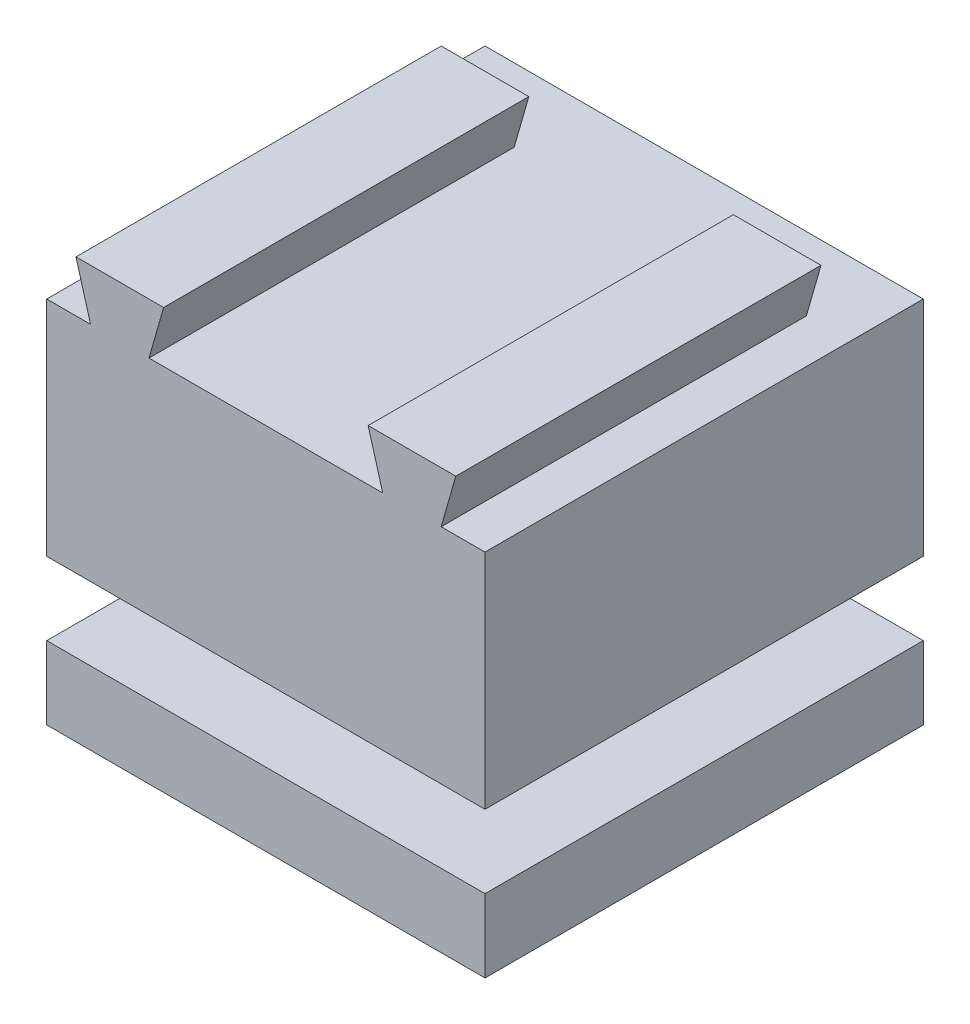
ISO-10303-21;
HEADER;
FILE_DESCRIPTION(('STEP AP214'),'2;1');
FILE_NAME('part.step','',(''),(''),'','','');
FILE_SCHEMA(('AUTOMOTIVE_DESIGN { 1 0 10303 214 1 1 1 1 }'));
ENDSEC;
DATA;
#1=APPLICATION_CONTEXT('core data for automotive mechanical design processes');
#2=APPLICATION_PROTOCOL_DEFINITION('international standard','automotive_design',2000,#1);
#3=PRODUCT_CONTEXT('',#1,'mechanical');
#4=PRODUCT('Part','Part','',(#3));
#5=PRODUCT_RELATED_PRODUCT_CATEGORY('part','',(#4));
#6=PRODUCT_DEFINITION_FORMATION('','',#4);
#7=PRODUCT_DEFINITION_CONTEXT('part definition',#1,'design');
#8=PRODUCT_DEFINITION('design','',#6,#7);
#9=PRODUCT_DEFINITION_SHAPE('','',#8);
#10=(LENGTH_UNIT() NAMED_UNIT(*) SI_UNIT(.MILLI.,.METRE.));
#11=(NAMED_UNIT(*) PLANE_ANGLE_UNIT() SI_UNIT($,.RADIAN.));
#12=(NAMED_UNIT(*) SI_UNIT($,.STERADIAN.) SOLID_ANGLE_UNIT());
#13=UNCERTAINTY_MEASURE_WITH_UNIT(LENGTH_MEASURE(1.E-05),#10,'distance_accuracy_value','');
#14=(GEOMETRIC_REPRESENTATION_CONTEXT(3) GLOBAL_UNCERTAINTY_ASSIGNED_CONTEXT((#13)) GLOBAL_UNIT_ASSIGNED_CONTEXT((#10,
#11,#12)) REPRESENTATION_CONTEXT('',''));
#15=CARTESIAN_POINT('',(0.,0.,0.));
#16=DIRECTION('',(0.,0.,1.));
#17=DIRECTION('',(1.,0.,0.));
#18=AXIS2_PLACEMENT_3D('',#15,#16,#17);
#19=CARTESIAN_POINT('',(30.,50.5,30.));
#20=DIRECTION('',(0.,0.,-1.));
#21=DIRECTION('',(-1.,0.,0.));
#22=AXIS2_PLACEMENT_3D('',#19,#20,#21);
#23=PLANE('',#22);
#24=DIRECTION('',(-1.,0.,0.));
#25=VECTOR('',#24,1.);
#26=CARTESIAN_POINT('',(-30.,20.,30.));
#27=LINE('',#26,#25);
#28=CARTESIAN_POINT('',(30.,20.,30.));
#29=VERTEX_POINT('',#28);
#30=CARTESIAN_POINT('',(-30.,20.,30.));
#31=VERTEX_POINT('',#30);
#32=EDGE_CURVE('E331',#29,#31,#27,.T.);
#33=ORIENTED_EDGE('',*,*,#32,.F.);
#34=DIRECTION('',(0.,-1.,0.));
#35=VECTOR('',#34,1.);
#36=CARTESIAN_POINT('',(30.,50.5,30.));
#37=LINE('',#36,#35);
#38=CARTESIAN_POINT('',(30.,50.5,30.));
#39=VERTEX_POINT('',#38);
#40=EDGE_CURVE('E11',#39,#29,#37,.T.);
#41=ORIENTED_EDGE('',*,*,#40,.F.);
#42=DIRECTION('',(1.,0.,0.));
#43=VECTOR('',#42,1.);
#44=CARTESIAN_POINT('',(30.,50.5,30.));
#45=LINE('',#44,#43);
#46=CARTESIAN_POINT('',(24.,50.5,30.));
#47=VERTEX_POINT('',#46);
#48=EDGE_CURVE('E39',#47,#39,#45,.T.);
#49=ORIENTED_EDGE('',*,*,#48,.F.);
#50=DIRECTION('',(0.274721127897378,0.961523947640823,0.));
#51=VECTOR('',#50,1.);
#52=CARTESIAN_POINT('',(24.,50.5,30.));
#53=LINE('',#52,#51);
#54=CARTESIAN_POINT('',(26.,57.5,30.));
#55=VERTEX_POINT('',#54);
#56=EDGE_CURVE('E218',#47,#55,#53,.T.);
#57=ORIENTED_EDGE('',*,*,#56,.T.);
#58=DIRECTION('',(1.,0.,0.));
#59=VECTOR('',#58,1.);
#60=CARTESIAN_POINT('',(14.,57.5,30.));
#61=LINE('',#60,#59);
#62=CARTESIAN_POINT('',(14.,57.5,30.));
#63=VERTEX_POINT('',#62);
#64=EDGE_CURVE('E207',#63,#55,#61,.T.);
#65=ORIENTED_EDGE('',*,*,#64,.F.);
#66=DIRECTION('',(0.274721127897378,-0.961523947640823,0.));
#67=VECTOR('',#66,1.);
#68=CARTESIAN_POINT('',(14.,57.5,30.));
#69=LINE('',#68,#67);
#70=CARTESIAN_POINT('',(16.,50.5,30.));
#71=VERTEX_POINT('',#70);
#72=EDGE_CURVE('E215',#63,#71,#69,.T.);
#73=ORIENTED_EDGE('',*,*,#72,.T.);
#74=CARTESIAN_POINT('',(-16.,50.5,30.));
#75=VERTEX_POINT('',#74);
#76=EDGE_CURVE('E277',#75,#71,#45,.T.);
#77=ORIENTED_EDGE('',*,*,#76,.F.);
#78=DIRECTION('',(0.274721127897378,0.961523947640823,0.));
#79=VECTOR('',#78,1.);
#80=CARTESIAN_POINT('',(-16.,50.5,30.));
#81=LINE('',#80,#79);
#82=CARTESIAN_POINT('',(-14.,57.5,30.));
#83=VERTEX_POINT('',#82);
#84=EDGE_CURVE('E248',#75,#83,#81,.T.);
#85=ORIENTED_EDGE('',*,*,#84,.T.);
#86=DIRECTION('',(1.,0.,0.));
#87=VECTOR('',#86,1.);
#88=CARTESIAN_POINT('',(-26.,57.5,30.));
#89=LINE('',#88,#87);
#90=CARTESIAN_POINT('',(-26.,57.5,30.));
#91=VERTEX_POINT('',#90);
#92=EDGE_CURVE('E237',#91,#83,#89,.T.);
#93=ORIENTED_EDGE('',*,*,#92,.F.);
#94=DIRECTION('',(0.274721127897378,-0.961523947640823,0.));
#95=VECTOR('',#94,1.);
#96=CARTESIAN_POINT('',(-26.,57.5,30.));
#97=LINE('',#96,#95);
#98=CARTESIAN_POINT('',(-24.,50.5,30.));
#99=VERTEX_POINT('',#98);
#100=EDGE_CURVE('E225',#91,#99,#97,.T.);
#101=ORIENTED_EDGE('',*,*,#100,.T.);
#102=CARTESIAN_POINT('',(-30.,50.5,30.));
#103=VERTEX_POINT('',#102);
#104=EDGE_CURVE('E279',#103,#99,#45,.T.);
#105=ORIENTED_EDGE('',*,*,#104,.F.);
#106=DIRECTION('',(0.,-1.,0.));
#107=VECTOR('',#106,1.);
#108=CARTESIAN_POINT('',(-30.,50.5,30.));
#109=LINE('',#108,#107);
#110=EDGE_CURVE('E290',#103,#31,#109,.T.);
#111=ORIENTED_EDGE('',*,*,#110,.T.);
#112=EDGE_LOOP('',(#33,#41,#49,#57,#65,#73,#77,#85,#93,#101,#105,#111));
#113=FACE_BOUND('',#112,.T.);
#114=ADVANCED_FACE('F35',(#113),#23,.F.);
#115=CARTESIAN_POINT('',(30.,50.5,30.));
#116=DIRECTION('',(-1.,0.,0.));
#117=DIRECTION('',(0.,0.,1.));
#118=AXIS2_PLACEMENT_3D('',#115,#116,#117);
#119=PLANE('',#118);
#120=ORIENTED_EDGE('',*,*,#40,.T.);
#121=DIRECTION('',(0.,0.,1.));
#122=VECTOR('',#121,1.);
#123=CARTESIAN_POINT('',(30.,20.,-30.));
#124=LINE('',#123,#122);
#125=CARTESIAN_POINT('',(30.,20.,-30.));
#126=VERTEX_POINT('',#125);
#127=EDGE_CURVE('E319',#126,#29,#124,.T.);
#128=ORIENTED_EDGE('',*,*,#127,.F.);
#129=DIRECTION('',(0.,-1.,0.));
#130=VECTOR('',#129,1.);
#131=CARTESIAN_POINT('',(30.,50.5,-30.));
#132=LINE('',#131,#130);
#133=CARTESIAN_POINT('',(30.,50.5,-30.));
#134=VERTEX_POINT('',#133);
#135=EDGE_CURVE('E282',#134,#126,#132,.T.);
#136=ORIENTED_EDGE('',*,*,#135,.F.);
#137=DIRECTION('',(0.,0.,-1.));
#138=VECTOR('',#137,1.);
#139=CARTESIAN_POINT('',(30.,50.5,30.));
#140=LINE('',#139,#138);
#141=EDGE_CURVE('E280',#39,#134,#140,.T.);
#142=ORIENTED_EDGE('',*,*,#141,.F.);
#143=EDGE_LOOP('',(#120,#128,#136,#142));
#144=FACE_BOUND('',#143,.T.);
#145=ADVANCED_FACE('F317',(#144),#119,.F.);
#146=CARTESIAN_POINT('',(-30.,50.5,30.));
#147=DIRECTION('',(1.,0.,0.));
#148=DIRECTION('',(0.,0.,-1.));
#149=AXIS2_PLACEMENT_3D('',#146,#147,#148);
#150=PLANE('',#149);
#151=DIRECTION('',(0.,-1.,0.));
#152=VECTOR('',#151,1.);
#153=CARTESIAN_POINT('',(-30.,50.5,-30.));
#154=LINE('',#153,#152);
#155=CARTESIAN_POINT('',(-30.,50.5,-30.));
#156=VERTEX_POINT('',#155);
#157=CARTESIAN_POINT('',(-30.,20.,-30.));
#158=VERTEX_POINT('',#157);
#159=EDGE_CURVE('E286',#156,#158,#154,.T.);
#160=ORIENTED_EDGE('',*,*,#159,.T.);
#161=DIRECTION('',(0.,0.,1.));
#162=VECTOR('',#161,1.);
#163=CARTESIAN_POINT('',(-30.,20.,-30.));
#164=LINE('',#163,#162);
#165=EDGE_CURVE('E197',#158,#31,#164,.T.);
#166=ORIENTED_EDGE('',*,*,#165,.T.);
#167=ORIENTED_EDGE('',*,*,#110,.F.);
#168=DIRECTION('',(0.,0.,1.));
#169=VECTOR('',#168,1.);
#170=CARTESIAN_POINT('',(-30.,50.5,30.));
#171=LINE('',#170,#169);
#172=EDGE_CURVE('E305',#156,#103,#171,.T.);
#173=ORIENTED_EDGE('',*,*,#172,.F.);
#174=EDGE_LOOP('',(#160,#166,#167,#173));
#175=FACE_BOUND('',#174,.T.);
#176=ADVANCED_FACE('F329',(#175),#150,.F.);
#177=CARTESIAN_POINT('',(0.,50.5,0.));
#178=DIRECTION('',(0.,-1.,0.));
#179=DIRECTION('',(0.,0.,-1.));
#180=AXIS2_PLACEMENT_3D('',#177,#178,#179);
#181=PLANE('',#180);
#182=ORIENTED_EDGE('',*,*,#76,.T.);
#183=DIRECTION('',(0.,0.,1.));
#184=VECTOR('',#183,1.);
#185=CARTESIAN_POINT('',(16.,50.5,-20.));
#186=LINE('',#185,#184);
#187=CARTESIAN_POINT('',(16.,50.5,-20.));
#188=VERTEX_POINT('',#187);
#189=EDGE_CURVE('E214',#188,#71,#186,.T.);
#190=ORIENTED_EDGE('',*,*,#189,.F.);
#191=DIRECTION('',(1.,0.,0.));
#192=VECTOR('',#191,1.);
#193=CARTESIAN_POINT('',(16.,50.5,-20.));
#194=LINE('',#193,#192);
#195=CARTESIAN_POINT('',(24.,50.5,-20.));
#196=VERTEX_POINT('',#195);
#197=EDGE_CURVE('E206',#188,#196,#194,.T.);
#198=ORIENTED_EDGE('',*,*,#197,.T.);
#199=DIRECTION('',(0.,0.,1.));
#200=VECTOR('',#199,1.);
#201=CARTESIAN_POINT('',(24.,50.5,-20.));
#202=LINE('',#201,#200);
#203=EDGE_CURVE('E228',#196,#47,#202,.T.);
#204=ORIENTED_EDGE('',*,*,#203,.T.);
#205=ORIENTED_EDGE('',*,*,#48,.T.);
#206=ORIENTED_EDGE('',*,*,#141,.T.);
#207=DIRECTION('',(-1.,0.,0.));
#208=VECTOR('',#207,1.);
#209=CARTESIAN_POINT('',(30.,50.5,-30.));
#210=LINE('',#209,#208);
#211=EDGE_CURVE('E307',#134,#156,#210,.T.);
#212=ORIENTED_EDGE('',*,*,#211,.T.);
#213=ORIENTED_EDGE('',*,*,#172,.T.);
#214=ORIENTED_EDGE('',*,*,#104,.T.);
#215=DIRECTION('',(0.,0.,1.));
#216=VECTOR('',#215,1.);
#217=CARTESIAN_POINT('',(-24.,50.5,-20.));
#218=LINE('',#217,#216);
#219=CARTESIAN_POINT('',(-24.,50.5,-20.));
#220=VERTEX_POINT('',#219);
#221=EDGE_CURVE('E245',#220,#99,#218,.T.);
#222=ORIENTED_EDGE('',*,*,#221,.F.);
#223=DIRECTION('',(1.,0.,0.));
#224=VECTOR('',#223,1.);
#225=CARTESIAN_POINT('',(-24.,50.5,-20.));
#226=LINE('',#225,#224);
#227=CARTESIAN_POINT('',(-16.,50.5,-20.));
#228=VERTEX_POINT('',#227);
#229=EDGE_CURVE('E236',#220,#228,#226,.T.);
#230=ORIENTED_EDGE('',*,*,#229,.T.);
#231=DIRECTION('',(0.,0.,1.));
#232=VECTOR('',#231,1.);
#233=CARTESIAN_POINT('',(-16.,50.5,-20.));
#234=LINE('',#233,#232);
#235=EDGE_CURVE('E254',#228,#75,#234,.T.);
#236=ORIENTED_EDGE('',*,*,#235,.T.);
#237=EDGE_LOOP('',(#182,#190,#198,#204,#205,#206,#212,#213,#214,#222,#230,#236));
#238=FACE_BOUND('',#237,.T.);
#239=ADVANCED_FACE('F311',(#238),#181,.F.);
#240=CARTESIAN_POINT('',(30.,10.,30.));
#241=VERTEX_POINT('',#240);
#242=CARTESIAN_POINT('',(30.,0.,30.));
#243=VERTEX_POINT('',#242);
#244=EDGE_CURVE('E45',#241,#243,#37,.T.);
#245=ORIENTED_EDGE('',*,*,#244,.F.);
#246=DIRECTION('',(1.,0.,0.));
#247=VECTOR('',#246,1.);
#248=CARTESIAN_POINT('',(-30.,10.,30.));
#249=LINE('',#248,#247);
#250=CARTESIAN_POINT('',(-30.,10.,30.));
#251=VERTEX_POINT('',#250);
#252=EDGE_CURVE('E333',#251,#241,#249,.T.);
#253=ORIENTED_EDGE('',*,*,#252,.F.);
#254=CARTESIAN_POINT('',(-30.,0.,30.));
#255=VERTEX_POINT('',#254);
#256=EDGE_CURVE('E293',#251,#255,#109,.T.);
#257=ORIENTED_EDGE('',*,*,#256,.T.);
#258=DIRECTION('',(1.,0.,0.));
#259=VECTOR('',#258,1.);
#260=CARTESIAN_POINT('',(30.,0.,30.));
#261=LINE('',#260,#259);
#262=EDGE_CURVE('E251',#255,#243,#261,.T.);
#263=ORIENTED_EDGE('',*,*,#262,.T.);
#264=EDGE_LOOP('',(#245,#253,#257,#263));
#265=FACE_BOUND('',#264,.T.);
#266=ADVANCED_FACE('F37',(#265),#23,.F.);
#267=CARTESIAN_POINT('',(30.,10.,-30.));
#268=VERTEX_POINT('',#267);
#269=CARTESIAN_POINT('',(30.,0.,-30.));
#270=VERTEX_POINT('',#269);
#271=EDGE_CURVE('E285',#268,#270,#132,.T.);
#272=ORIENTED_EDGE('',*,*,#271,.F.);
#273=DIRECTION('',(0.,0.,1.));
#274=VECTOR('',#273,1.);
#275=CARTESIAN_POINT('',(30.,10.,-30.));
#276=LINE('',#275,#274);
#277=EDGE_CURVE('E53',#268,#241,#276,.T.);
#278=ORIENTED_EDGE('',*,*,#277,.T.);
#279=ORIENTED_EDGE('',*,*,#244,.T.);
#280=DIRECTION('',(0.,0.,-1.));
#281=VECTOR('',#280,1.);
#282=CARTESIAN_POINT('',(30.,0.,30.));
#283=LINE('',#282,#281);
#284=EDGE_CURVE('E300',#243,#270,#283,.T.);
#285=ORIENTED_EDGE('',*,*,#284,.T.);
#286=EDGE_LOOP('',(#272,#278,#279,#285));
#287=FACE_BOUND('',#286,.T.);
#288=ADVANCED_FACE('F361',(#287),#119,.F.);
#289=CARTESIAN_POINT('',(30.,50.5,-30.));
#290=DIRECTION('',(0.,0.,1.));
#291=DIRECTION('',(1.,0.,0.));
#292=AXIS2_PLACEMENT_3D('',#289,#290,#291);
#293=PLANE('',#292);
#294=ORIENTED_EDGE('',*,*,#135,.T.);
#295=DIRECTION('',(-1.,0.,0.));
#296=VECTOR('',#295,1.);
#297=CARTESIAN_POINT('',(20.,20.,-30.));
#298=LINE('',#297,#296);
#299=CARTESIAN_POINT('',(20.,20.,-30.));
#300=VERTEX_POINT('',#299);
#301=EDGE_CURVE('E336',#126,#300,#298,.T.);
#302=ORIENTED_EDGE('',*,*,#301,.T.);
#303=DIRECTION('',(0.,-1.,0.));
#304=VECTOR('',#303,1.);
#305=CARTESIAN_POINT('',(20.,20.,-30.));
#306=LINE('',#305,#304);
#307=CARTESIAN_POINT('',(20.,10.,-30.));
#308=VERTEX_POINT('',#307);
#309=EDGE_CURVE('E580',#300,#308,#306,.T.);
#310=ORIENTED_EDGE('',*,*,#309,.T.);
#311=DIRECTION('',(1.,0.,0.));
#312=VECTOR('',#311,1.);
#313=CARTESIAN_POINT('',(20.,10.,-30.));
#314=LINE('',#313,#312);
#315=EDGE_CURVE('E585',#308,#268,#314,.T.);
#316=ORIENTED_EDGE('',*,*,#315,.T.);
#317=ORIENTED_EDGE('',*,*,#271,.T.);
#318=DIRECTION('',(-1.,0.,0.));
#319=VECTOR('',#318,1.);
#320=CARTESIAN_POINT('',(30.,0.,-30.));
#321=LINE('',#320,#319);
#322=CARTESIAN_POINT('',(-30.,0.,-30.));
#323=VERTEX_POINT('',#322);
#324=EDGE_CURVE('E297',#270,#323,#321,.T.);
#325=ORIENTED_EDGE('',*,*,#324,.T.);
#326=CARTESIAN_POINT('',(-30.,10.,-30.));
#327=VERTEX_POINT('',#326);
#328=EDGE_CURVE('E289',#327,#323,#154,.T.);
#329=ORIENTED_EDGE('',*,*,#328,.F.);
#330=DIRECTION('',(1.,0.,0.));
#331=VECTOR('',#330,1.);
#332=CARTESIAN_POINT('',(-30.,10.,-30.));
#333=LINE('',#332,#331);
#334=CARTESIAN_POINT('',(-20.,10.,-30.));
#335=VERTEX_POINT('',#334);
#336=EDGE_CURVE('E60',#327,#335,#333,.T.);
#337=ORIENTED_EDGE('',*,*,#336,.T.);
#338=DIRECTION('',(0.,1.,0.));
#339=VECTOR('',#338,1.);
#340=CARTESIAN_POINT('',(-20.,20.,-30.));
#341=LINE('',#340,#339);
#342=CARTESIAN_POINT('',(-20.,20.,-30.));
#343=VERTEX_POINT('',#342);
#344=EDGE_CURVE('E193',#335,#343,#341,.T.);
#345=ORIENTED_EDGE('',*,*,#344,.T.);
#346=DIRECTION('',(-1.,0.,0.));
#347=VECTOR('',#346,1.);
#348=CARTESIAN_POINT('',(-30.,20.,-30.));
#349=LINE('',#348,#347);
#350=EDGE_CURVE('E199',#343,#158,#349,.T.);
#351=ORIENTED_EDGE('',*,*,#350,.T.);
#352=ORIENTED_EDGE('',*,*,#159,.F.);
#353=ORIENTED_EDGE('',*,*,#211,.F.);
#354=EDGE_LOOP('',(#294,#302,#310,#316,#317,#325,#329,#337,#345,#351,#352,#353));
#355=FACE_BOUND('',#354,.T.);
#356=ADVANCED_FACE('F322',(#355),#293,.F.);
#357=ORIENTED_EDGE('',*,*,#256,.F.);
#358=DIRECTION('',(0.,0.,1.));
#359=VECTOR('',#358,1.);
#360=CARTESIAN_POINT('',(-30.,10.,-30.));
#361=LINE('',#360,#359);
#362=EDGE_CURVE('E195',#327,#251,#361,.T.);
#363=ORIENTED_EDGE('',*,*,#362,.F.);
#364=ORIENTED_EDGE('',*,*,#328,.T.);
#365=DIRECTION('',(0.,0.,1.));
#366=VECTOR('',#365,1.);
#367=CARTESIAN_POINT('',(-30.,0.,30.));
#368=LINE('',#367,#366);
#369=EDGE_CURVE('E294',#323,#255,#368,.T.);
#370=ORIENTED_EDGE('',*,*,#369,.T.);
#371=EDGE_LOOP('',(#357,#363,#364,#370));
#372=FACE_BOUND('',#371,.T.);
#373=ADVANCED_FACE('F353',(#372),#150,.F.);
#374=CARTESIAN_POINT('',(0.,0.,0.));
#375=DIRECTION('',(0.,-1.,0.));
#376=DIRECTION('',(0.,0.,-1.));
#377=AXIS2_PLACEMENT_3D('',#374,#375,#376);
#378=PLANE('',#377);
#379=ORIENTED_EDGE('',*,*,#262,.F.);
#380=ORIENTED_EDGE('',*,*,#369,.F.);
#381=ORIENTED_EDGE('',*,*,#324,.F.);
#382=ORIENTED_EDGE('',*,*,#284,.F.);
#383=EDGE_LOOP('',(#379,#380,#381,#382));
#384=FACE_BOUND('',#383,.T.);
#385=ADVANCED_FACE('F363',(#384),#378,.T.);
#386=CARTESIAN_POINT('',(-26.,57.5,-20.));
#387=DIRECTION('',(-0.961523947640823,-0.274721127897378,0.));
#388=DIRECTION('',(0.274721127897378,-0.961523947640823,0.));
#389=AXIS2_PLACEMENT_3D('',#386,#387,#388);
#390=PLANE('',#389);
#391=ORIENTED_EDGE('',*,*,#100,.F.);
#392=DIRECTION('',(0.,0.,1.));
#393=VECTOR('',#392,1.);
#394=CARTESIAN_POINT('',(-26.,57.5,-20.));
#395=LINE('',#394,#393);
#396=CARTESIAN_POINT('',(-26.,57.5,-20.));
#397=VERTEX_POINT('',#396);
#398=EDGE_CURVE('E249',#397,#91,#395,.T.);
#399=ORIENTED_EDGE('',*,*,#398,.F.);
#400=DIRECTION('',(0.274721127897378,-0.961523947640823,0.));
#401=VECTOR('',#400,1.);
#402=CARTESIAN_POINT('',(-26.,57.5,-20.));
#403=LINE('',#402,#401);
#404=EDGE_CURVE('E233',#397,#220,#403,.T.);
#405=ORIENTED_EDGE('',*,*,#404,.T.);
#406=ORIENTED_EDGE('',*,*,#221,.T.);
#407=EDGE_LOOP('',(#391,#399,#405,#406));
#408=FACE_BOUND('',#407,.T.);
#409=ADVANCED_FACE('F365',(#408),#390,.T.);
#410=CARTESIAN_POINT('',(-26.,57.5,-20.));
#411=DIRECTION('',(0.,-1.,0.));
#412=DIRECTION('',(0.,0.,-1.));
#413=AXIS2_PLACEMENT_3D('',#410,#411,#412);
#414=PLANE('',#413);
#415=ORIENTED_EDGE('',*,*,#92,.T.);
#416=DIRECTION('',(0.,0.,1.));
#417=VECTOR('',#416,1.);
#418=CARTESIAN_POINT('',(-14.,57.5,-20.));
#419=LINE('',#418,#417);
#420=CARTESIAN_POINT('',(-14.,57.5,-20.));
#421=VERTEX_POINT('',#420);
#422=EDGE_CURVE('E252',#421,#83,#419,.T.);
#423=ORIENTED_EDGE('',*,*,#422,.F.);
#424=DIRECTION('',(1.,0.,0.));
#425=VECTOR('',#424,1.);
#426=CARTESIAN_POINT('',(-26.,57.5,-20.));
#427=LINE('',#426,#425);
#428=EDGE_CURVE('E243',#397,#421,#427,.T.);
#429=ORIENTED_EDGE('',*,*,#428,.F.);
#430=ORIENTED_EDGE('',*,*,#398,.T.);
#431=EDGE_LOOP('',(#415,#423,#429,#430));
#432=FACE_BOUND('',#431,.T.);
#433=ADVANCED_FACE('F371',(#432),#414,.F.);
#434=CARTESIAN_POINT('',(-16.,50.5,-20.));
#435=DIRECTION('',(0.961523947640823,-0.274721127897378,0.));
#436=DIRECTION('',(0.274721127897378,0.961523947640823,0.));
#437=AXIS2_PLACEMENT_3D('',#434,#435,#436);
#438=PLANE('',#437);
#439=ORIENTED_EDGE('',*,*,#84,.F.);
#440=ORIENTED_EDGE('',*,*,#235,.F.);
#441=DIRECTION('',(0.274721127897378,0.961523947640823,0.));
#442=VECTOR('',#441,1.);
#443=CARTESIAN_POINT('',(-16.,50.5,-20.));
#444=LINE('',#443,#442);
#445=EDGE_CURVE('E240',#228,#421,#444,.T.);
#446=ORIENTED_EDGE('',*,*,#445,.T.);
#447=ORIENTED_EDGE('',*,*,#422,.T.);
#448=EDGE_LOOP('',(#439,#440,#446,#447));
#449=FACE_BOUND('',#448,.T.);
#450=ADVANCED_FACE('F389',(#449),#438,.T.);
#451=CARTESIAN_POINT('',(0.,0.,-20.));
#452=DIRECTION('',(0.,0.,1.));
#453=DIRECTION('',(1.,0.,0.));
#454=AXIS2_PLACEMENT_3D('',#451,#452,#453);
#455=PLANE('',#454);
#456=ORIENTED_EDGE('',*,*,#404,.F.);
#457=ORIENTED_EDGE('',*,*,#428,.T.);
#458=ORIENTED_EDGE('',*,*,#445,.F.);
#459=ORIENTED_EDGE('',*,*,#229,.F.);
#460=EDGE_LOOP('',(#456,#457,#458,#459));
#461=FACE_BOUND('',#460,.T.);
#462=ADVANCED_FACE('F392',(#461),#455,.F.);
#463=CARTESIAN_POINT('',(14.,57.5,-20.));
#464=DIRECTION('',(-0.961523947640823,-0.274721127897378,0.));
#465=DIRECTION('',(0.274721127897378,-0.961523947640823,0.));
#466=AXIS2_PLACEMENT_3D('',#463,#464,#465);
#467=PLANE('',#466);
#468=ORIENTED_EDGE('',*,*,#72,.F.);
#469=DIRECTION('',(0.,0.,1.));
#470=VECTOR('',#469,1.);
#471=CARTESIAN_POINT('',(14.,57.5,-20.));
#472=LINE('',#471,#470);
#473=CARTESIAN_POINT('',(14.,57.5,-20.));
#474=VERTEX_POINT('',#473);
#475=EDGE_CURVE('E223',#474,#63,#472,.T.);
#476=ORIENTED_EDGE('',*,*,#475,.F.);
#477=DIRECTION('',(0.274721127897378,-0.961523947640823,0.));
#478=VECTOR('',#477,1.);
#479=CARTESIAN_POINT('',(14.,57.5,-20.));
#480=LINE('',#479,#478);
#481=EDGE_CURVE('E203',#474,#188,#480,.T.);
#482=ORIENTED_EDGE('',*,*,#481,.T.);
#483=ORIENTED_EDGE('',*,*,#189,.T.);
#484=EDGE_LOOP('',(#468,#476,#482,#483));
#485=FACE_BOUND('',#484,.T.);
#486=ADVANCED_FACE('F399',(#485),#467,.T.);
#487=CARTESIAN_POINT('',(14.,57.5,-20.));
#488=DIRECTION('',(0.,-1.,0.));
#489=DIRECTION('',(0.,0.,-1.));
#490=AXIS2_PLACEMENT_3D('',#487,#488,#489);
#491=PLANE('',#490);
#492=ORIENTED_EDGE('',*,*,#64,.T.);
#493=DIRECTION('',(0.,0.,1.));
#494=VECTOR('',#493,1.);
#495=CARTESIAN_POINT('',(26.,57.5,-20.));
#496=LINE('',#495,#494);
#497=CARTESIAN_POINT('',(26.,57.5,-20.));
#498=VERTEX_POINT('',#497);
#499=EDGE_CURVE('E226',#498,#55,#496,.T.);
#500=ORIENTED_EDGE('',*,*,#499,.F.);
#501=DIRECTION('',(1.,0.,0.));
#502=VECTOR('',#501,1.);
#503=CARTESIAN_POINT('',(14.,57.5,-20.));
#504=LINE('',#503,#502);
#505=EDGE_CURVE('E212',#474,#498,#504,.T.);
#506=ORIENTED_EDGE('',*,*,#505,.F.);
#507=ORIENTED_EDGE('',*,*,#475,.T.);
#508=EDGE_LOOP('',(#492,#500,#506,#507));
#509=FACE_BOUND('',#508,.T.);
#510=ADVANCED_FACE('F403',(#509),#491,.F.);
#511=CARTESIAN_POINT('',(24.,50.5,-20.));
#512=DIRECTION('',(0.961523947640823,-0.274721127897378,0.));
#513=DIRECTION('',(0.274721127897378,0.961523947640823,0.));
#514=AXIS2_PLACEMENT_3D('',#511,#512,#513);
#515=PLANE('',#514);
#516=ORIENTED_EDGE('',*,*,#56,.F.);
#517=ORIENTED_EDGE('',*,*,#203,.F.);
#518=DIRECTION('',(0.274721127897378,0.961523947640823,0.));
#519=VECTOR('',#518,1.);
#520=CARTESIAN_POINT('',(24.,50.5,-20.));
#521=LINE('',#520,#519);
#522=EDGE_CURVE('E209',#196,#498,#521,.T.);
#523=ORIENTED_EDGE('',*,*,#522,.T.);
#524=ORIENTED_EDGE('',*,*,#499,.T.);
#525=EDGE_LOOP('',(#516,#517,#523,#524));
#526=FACE_BOUND('',#525,.T.);
#527=ADVANCED_FACE('F405',(#526),#515,.T.);
#528=CARTESIAN_POINT('',(40.,0.,-20.));
#529=DIRECTION('',(0.,0.,1.));
#530=DIRECTION('',(1.,0.,0.));
#531=AXIS2_PLACEMENT_3D('',#528,#529,#530);
#532=PLANE('',#531);
#533=ORIENTED_EDGE('',*,*,#481,.F.);
#534=ORIENTED_EDGE('',*,*,#505,.T.);
#535=ORIENTED_EDGE('',*,*,#522,.F.);
#536=ORIENTED_EDGE('',*,*,#197,.F.);
#537=EDGE_LOOP('',(#533,#534,#535,#536));
#538=FACE_BOUND('',#537,.T.);
#539=ADVANCED_FACE('F408',(#538),#532,.F.);
#540=CARTESIAN_POINT('',(-30.,20.,-30.));
#541=DIRECTION('',(0.,1.,0.));
#542=DIRECTION('',(0.,0.,1.));
#543=AXIS2_PLACEMENT_3D('',#540,#541,#542);
#544=PLANE('',#543);
#545=ORIENTED_EDGE('',*,*,#32,.T.);
#546=ORIENTED_EDGE('',*,*,#165,.F.);
#547=ORIENTED_EDGE('',*,*,#350,.F.);
#548=DIRECTION('',(0.,0.,1.));
#549=VECTOR('',#548,1.);
#550=CARTESIAN_POINT('',(-20.,20.,-30.));
#551=LINE('',#550,#549);
#552=CARTESIAN_POINT('',(-19.9999999999996,20.,20.));
#553=VERTEX_POINT('',#552);
#554=EDGE_CURVE('E194',#343,#553,#551,.T.);
#555=ORIENTED_EDGE('',*,*,#554,.T.);
#556=DIRECTION('',(-1.,0.,0.));
#557=VECTOR('',#556,1.);
#558=CARTESIAN_POINT('',(30.0000000000004,20.,20.000000000002));
#559=LINE('',#558,#557);
#560=CARTESIAN_POINT('',(20.,20.,20.0000000000016));
#561=VERTEX_POINT('',#560);
#562=EDGE_CURVE('E182',#561,#553,#559,.T.);
#563=ORIENTED_EDGE('',*,*,#562,.F.);
#564=DIRECTION('',(0.,0.,1.));
#565=VECTOR('',#564,1.);
#566=CARTESIAN_POINT('',(20.,20.,-30.));
#567=LINE('',#566,#565);
#568=EDGE_CURVE('E337',#300,#561,#567,.T.);
#569=ORIENTED_EDGE('',*,*,#568,.F.);
#570=ORIENTED_EDGE('',*,*,#301,.F.);
#571=ORIENTED_EDGE('',*,*,#127,.T.);
#572=EDGE_LOOP('',(#545,#546,#547,#555,#563,#569,#570,#571));
#573=FACE_BOUND('',#572,.T.);
#574=ADVANCED_FACE('F335',(#573),#544,.F.);
#575=CARTESIAN_POINT('',(-20.,20.,-30.));
#576=DIRECTION('',(1.,0.,0.));
#577=DIRECTION('',(0.,0.,-1.));
#578=AXIS2_PLACEMENT_3D('',#575,#576,#577);
#579=PLANE('',#578);
#580=DIRECTION('',(0.,0.,1.));
#581=VECTOR('',#580,1.);
#582=CARTESIAN_POINT('',(-20.,10.,-30.));
#583=LINE('',#582,#581);
#584=CARTESIAN_POINT('',(-19.9999999999996,10.,20.));
#585=VERTEX_POINT('',#584);
#586=EDGE_CURVE('E177',#335,#585,#583,.T.);
#587=ORIENTED_EDGE('',*,*,#586,.T.);
#588=DIRECTION('',(0.,-1.,0.));
#589=VECTOR('',#588,1.);
#590=CARTESIAN_POINT('',(-19.9999999999996,20.,20.));
#591=LINE('',#590,#589);
#592=EDGE_CURVE('E183',#553,#585,#591,.T.);
#593=ORIENTED_EDGE('',*,*,#592,.F.);
#594=ORIENTED_EDGE('',*,*,#554,.F.);
#595=ORIENTED_EDGE('',*,*,#344,.F.);
#596=EDGE_LOOP('',(#587,#593,#594,#595));
#597=FACE_BOUND('',#596,.T.);
#598=ADVANCED_FACE('F191',(#597),#579,.F.);
#599=CARTESIAN_POINT('',(-30.,10.,-30.));
#600=DIRECTION('',(0.,-1.,0.));
#601=DIRECTION('',(0.,0.,-1.));
#602=AXIS2_PLACEMENT_3D('',#599,#600,#601);
#603=PLANE('',#602);
#604=ORIENTED_EDGE('',*,*,#252,.T.);
#605=ORIENTED_EDGE('',*,*,#277,.F.);
#606=ORIENTED_EDGE('',*,*,#315,.F.);
#607=DIRECTION('',(0.,0.,1.));
#608=VECTOR('',#607,1.);
#609=CARTESIAN_POINT('',(20.,10.,-30.));
#610=LINE('',#609,#608);
#611=CARTESIAN_POINT('',(20.,10.,20.0000000000016));
#612=VERTEX_POINT('',#611);
#613=EDGE_CURVE('E179',#308,#612,#610,.T.);
#614=ORIENTED_EDGE('',*,*,#613,.T.);
#615=DIRECTION('',(-1.,0.,0.));
#616=VECTOR('',#615,1.);
#617=CARTESIAN_POINT('',(30.0000000000004,10.,20.000000000002));
#618=LINE('',#617,#616);
#619=EDGE_CURVE('E173',#612,#585,#618,.T.);
#620=ORIENTED_EDGE('',*,*,#619,.T.);
#621=ORIENTED_EDGE('',*,*,#586,.F.);
#622=ORIENTED_EDGE('',*,*,#336,.F.);
#623=ORIENTED_EDGE('',*,*,#362,.T.);
#624=EDGE_LOOP('',(#604,#605,#606,#614,#620,#621,#622,#623));
#625=FACE_BOUND('',#624,.T.);
#626=ADVANCED_FACE('F175',(#625),#603,.F.);
#627=CARTESIAN_POINT('',(20.,20.,-30.));
#628=DIRECTION('',(-1.,0.,0.));
#629=DIRECTION('',(0.,0.,1.));
#630=AXIS2_PLACEMENT_3D('',#627,#628,#629);
#631=PLANE('',#630);
#632=ORIENTED_EDGE('',*,*,#568,.T.);
#633=DIRECTION('',(0.,-1.,0.));
#634=VECTOR('',#633,1.);
#635=CARTESIAN_POINT('',(20.,20.,20.0000000000016));
#636=LINE('',#635,#634);
#637=EDGE_CURVE('E578',#561,#612,#636,.T.);
#638=ORIENTED_EDGE('',*,*,#637,.T.);
#639=ORIENTED_EDGE('',*,*,#613,.F.);
#640=ORIENTED_EDGE('',*,*,#309,.F.);
#641=EDGE_LOOP('',(#632,#638,#639,#640));
#642=FACE_BOUND('',#641,.T.);
#643=ADVANCED_FACE('F418',(#642),#631,.F.);
#644=CARTESIAN_POINT('',(30.0000000000004,20.,20.000000000002));
#645=DIRECTION('',(0.,0.,-1.));
#646=DIRECTION('',(-1.,0.,0.));
#647=AXIS2_PLACEMENT_3D('',#644,#645,#646);
#648=PLANE('',#647);
#649=ORIENTED_EDGE('',*,*,#562,.T.);
#650=ORIENTED_EDGE('',*,*,#592,.T.);
#651=ORIENTED_EDGE('',*,*,#619,.F.);
#652=ORIENTED_EDGE('',*,*,#637,.F.);
#653=EDGE_LOOP('',(#649,#650,#651,#652));
#654=FACE_BOUND('',#653,.T.);
#655=ADVANCED_FACE('F186',(#654),#648,.F.);
#656=CLOSED_SHELL('',(#114,#145,#176,#239,#266,#288,#356,#373,#385,#409,#433,#450,#462,#486,
#510,#527,#539,#574,#598,#626,#643,#655));
#657=MANIFOLD_SOLID_BREP('B2',#656);
#658=ADVANCED_BREP_SHAPE_REPRESENTATION('',(#18,#657),#14);
#659=SHAPE_DEFINITION_REPRESENTATION(#9,#658);
ENDSEC;
END-ISO-10303-21;
